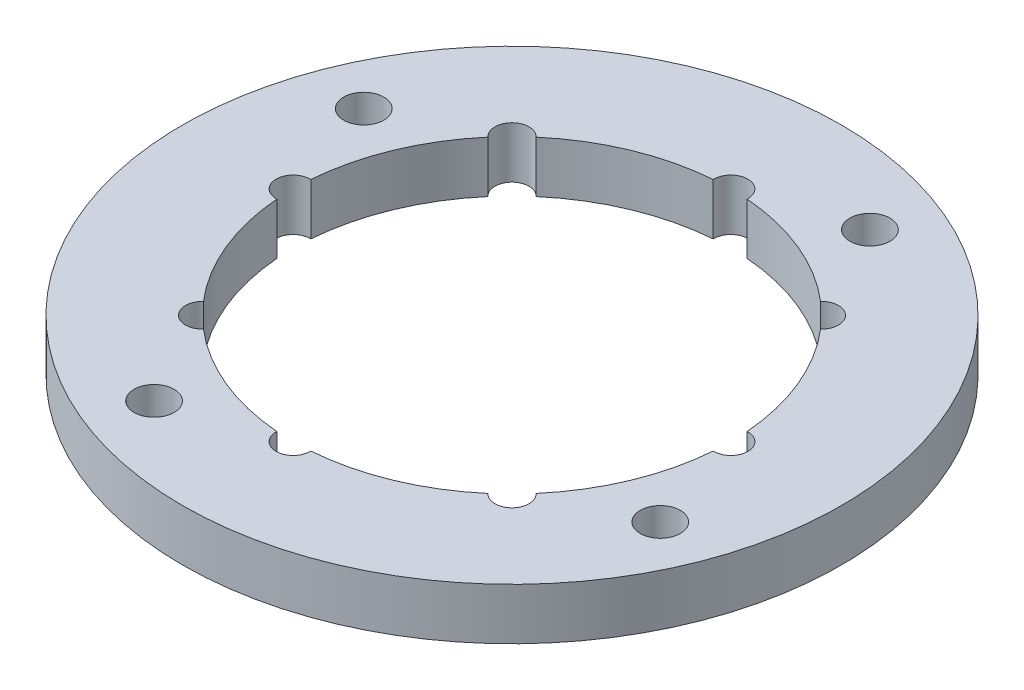
ISO-10303-21;
HEADER;
FILE_DESCRIPTION(('STEP AP214'),'2;1');
FILE_NAME('part.step','',(''),(''),'','','');
FILE_SCHEMA(('AUTOMOTIVE_DESIGN { 1 0 10303 214 1 1 1 1 }'));
ENDSEC;
DATA;
#1=APPLICATION_CONTEXT('core data for automotive mechanical design processes');
#2=APPLICATION_PROTOCOL_DEFINITION('international standard','automotive_design',2000,#1);
#3=PRODUCT_CONTEXT('',#1,'mechanical');
#4=PRODUCT('Part','Part','',(#3));
#5=PRODUCT_RELATED_PRODUCT_CATEGORY('part','',(#4));
#6=PRODUCT_DEFINITION_FORMATION('','',#4);
#7=PRODUCT_DEFINITION_CONTEXT('part definition',#1,'design');
#8=PRODUCT_DEFINITION('design','',#6,#7);
#9=PRODUCT_DEFINITION_SHAPE('','',#8);
#10=(LENGTH_UNIT() NAMED_UNIT(*) SI_UNIT(.MILLI.,.METRE.));
#11=(NAMED_UNIT(*) PLANE_ANGLE_UNIT() SI_UNIT($,.RADIAN.));
#12=(NAMED_UNIT(*) SI_UNIT($,.STERADIAN.) SOLID_ANGLE_UNIT());
#13=UNCERTAINTY_MEASURE_WITH_UNIT(LENGTH_MEASURE(1.E-05),#10,'distance_accuracy_value','');
#14=(GEOMETRIC_REPRESENTATION_CONTEXT(3) GLOBAL_UNCERTAINTY_ASSIGNED_CONTEXT((#13)) GLOBAL_UNIT_ASSIGNED_CONTEXT((#10,
#11,#12)) REPRESENTATION_CONTEXT('',''));
#15=CARTESIAN_POINT('',(0.,0.,0.));
#16=DIRECTION('',(0.,0.,1.));
#17=DIRECTION('',(1.,0.,0.));
#18=AXIS2_PLACEMENT_3D('',#15,#16,#17);
#19=CARTESIAN_POINT('',(-19.0830442572718,6.35,-19.0830442572718));
#20=DIRECTION('',(0.,-1.,0.));
#21=DIRECTION('',(0.,0.,-1.));
#22=AXIS2_PLACEMENT_3D('',#19,#20,#21);
#23=CYLINDRICAL_SURFACE('',#22,2.09550000000003);
#24=CARTESIAN_POINT('',(-19.0830442572718,0.,-19.0830442572718));
#25=DIRECTION('',(0.,1.,0.));
#26=DIRECTION('',(0.,0.,1.));
#27=AXIS2_PLACEMENT_3D('',#24,#25,#26);
#28=CIRCLE('',#27,2.09550000000003);
#29=CARTESIAN_POINT('',(-20.5061429417451,0.,-17.5448926443771));
#30=VERTEX_POINT('',#29);
#31=CARTESIAN_POINT('',(-17.5448926443771,0.,-20.5061429417451));
#32=VERTEX_POINT('',#31);
#33=EDGE_CURVE('E203',#30,#32,#28,.F.);
#34=ORIENTED_EDGE('',*,*,#33,.T.);
#35=DIRECTION('',(0.,-1.,0.));
#36=VECTOR('',#35,1.);
#37=CARTESIAN_POINT('',(-17.5448926443771,6.35,-20.5061429417451));
#38=LINE('',#37,#36);
#39=CARTESIAN_POINT('',(-17.5448926443771,6.35,-20.5061429417451));
#40=VERTEX_POINT('',#39);
#41=EDGE_CURVE('E11',#40,#32,#38,.T.);
#42=ORIENTED_EDGE('',*,*,#41,.F.);
#43=CARTESIAN_POINT('',(-19.0830442572718,6.35,-19.0830442572718));
#44=DIRECTION('',(0.,1.,0.));
#45=DIRECTION('',(0.,0.,1.));
#46=AXIS2_PLACEMENT_3D('',#43,#44,#45);
#47=CIRCLE('',#46,2.09550000000003);
#48=CARTESIAN_POINT('',(-20.5061429417451,6.35,-17.5448926443771));
#49=VERTEX_POINT('',#48);
#50=EDGE_CURVE('E318',#49,#40,#47,.F.);
#51=ORIENTED_EDGE('',*,*,#50,.F.);
#52=DIRECTION('',(0.,-1.,0.));
#53=VECTOR('',#52,1.);
#54=CARTESIAN_POINT('',(-20.5061429417451,6.35,-17.5448926443771));
#55=LINE('',#54,#53);
#56=EDGE_CURVE('E185',#49,#30,#55,.T.);
#57=ORIENTED_EDGE('',*,*,#56,.T.);
#58=EDGE_LOOP('',(#34,#42,#51,#57));
#59=FACE_BOUND('',#58,.T.);
#60=ADVANCED_FACE('F41',(#59),#23,.F.);
#61=CARTESIAN_POINT('',(0.,6.35,0.));
#62=DIRECTION('',(0.,-1.,0.));
#63=DIRECTION('',(0.,0.,-1.));
#64=AXIS2_PLACEMENT_3D('',#61,#62,#63);
#65=CYLINDRICAL_SURFACE('',#64,26.9875);
#66=CARTESIAN_POINT('',(0.,0.,0.));
#67=DIRECTION('',(0.,1.,0.));
#68=DIRECTION('',(0.,0.,1.));
#69=AXIS2_PLACEMENT_3D('',#66,#67,#68);
#70=CIRCLE('',#69,26.9875);
#71=CARTESIAN_POINT('',(-2.09392016605936,0.,-26.9061452941177));
#72=VERTEX_POINT('',#71);
#73=EDGE_CURVE('E204',#32,#72,#70,.F.);
#74=ORIENTED_EDGE('',*,*,#73,.T.);
#75=DIRECTION('',(0.,-1.,0.));
#76=VECTOR('',#75,1.);
#77=CARTESIAN_POINT('',(-2.09392016605936,6.35,-26.9061452941177));
#78=LINE('',#77,#76);
#79=CARTESIAN_POINT('',(-2.09392016605936,6.35,-26.9061452941177));
#80=VERTEX_POINT('',#79);
#81=EDGE_CURVE('E49',#80,#72,#78,.T.);
#82=ORIENTED_EDGE('',*,*,#81,.F.);
#83=CARTESIAN_POINT('',(0.,6.35,0.));
#84=DIRECTION('',(0.,1.,0.));
#85=DIRECTION('',(0.,0.,1.));
#86=AXIS2_PLACEMENT_3D('',#83,#84,#85);
#87=CIRCLE('',#86,26.9875);
#88=EDGE_CURVE('E122',#40,#80,#87,.F.);
#89=ORIENTED_EDGE('',*,*,#88,.F.);
#90=ORIENTED_EDGE('',*,*,#41,.T.);
#91=EDGE_LOOP('',(#74,#82,#89,#90));
#92=FACE_BOUND('',#91,.T.);
#93=ADVANCED_FACE('F334',(#92),#65,.F.);
#94=CARTESIAN_POINT('',(1.11022302462516E-13,6.35,-26.9874999999999));
#95=DIRECTION('',(0.,-1.,0.));
#96=DIRECTION('',(0.,0.,-1.));
#97=AXIS2_PLACEMENT_3D('',#94,#95,#96);
#98=CYLINDRICAL_SURFACE('',#97,2.09549999999993);
#99=CARTESIAN_POINT('',(1.11022302462516E-13,0.,-26.9874999999999));
#100=DIRECTION('',(0.,1.,0.));
#101=DIRECTION('',(0.,0.,1.));
#102=AXIS2_PLACEMENT_3D('',#99,#100,#101);
#103=CIRCLE('',#102,2.09549999999993);
#104=CARTESIAN_POINT('',(2.09392016605958,0.,-26.9061452941177));
#105=VERTEX_POINT('',#104);
#106=EDGE_CURVE('E206',#72,#105,#103,.F.);
#107=ORIENTED_EDGE('',*,*,#106,.T.);
#108=DIRECTION('',(0.,-1.,0.));
#109=VECTOR('',#108,1.);
#110=CARTESIAN_POINT('',(2.09392016605958,6.35,-26.9061452941177));
#111=LINE('',#110,#109);
#112=CARTESIAN_POINT('',(2.09392016605958,6.35,-26.9061452941177));
#113=VERTEX_POINT('',#112);
#114=EDGE_CURVE('E265',#113,#105,#111,.T.);
#115=ORIENTED_EDGE('',*,*,#114,.F.);
#116=CARTESIAN_POINT('',(1.11022302462516E-13,6.35,-26.9874999999999));
#117=DIRECTION('',(0.,1.,0.));
#118=DIRECTION('',(0.,0.,1.));
#119=AXIS2_PLACEMENT_3D('',#116,#117,#118);
#120=CIRCLE('',#119,2.09549999999993);
#121=EDGE_CURVE('E269',#80,#113,#120,.F.);
#122=ORIENTED_EDGE('',*,*,#121,.F.);
#123=ORIENTED_EDGE('',*,*,#81,.T.);
#124=EDGE_LOOP('',(#107,#115,#122,#123));
#125=FACE_BOUND('',#124,.T.);
#126=ADVANCED_FACE('F268',(#125),#98,.F.);
#127=CARTESIAN_POINT('',(0.,6.35,0.));
#128=DIRECTION('',(0.,-1.,0.));
#129=DIRECTION('',(0.,0.,-1.));
#130=AXIS2_PLACEMENT_3D('',#127,#128,#129);
#131=CYLINDRICAL_SURFACE('',#130,26.9875);
#132=CARTESIAN_POINT('',(0.,0.,0.));
#133=DIRECTION('',(0.,1.,0.));
#134=DIRECTION('',(0.,0.,1.));
#135=AXIS2_PLACEMENT_3D('',#132,#133,#134);
#136=CIRCLE('',#135,26.9875);
#137=CARTESIAN_POINT('',(17.5448926443797,0.,-20.5061429417429));
#138=VERTEX_POINT('',#137);
#139=EDGE_CURVE('E208',#105,#138,#136,.F.);
#140=ORIENTED_EDGE('',*,*,#139,.T.);
#141=DIRECTION('',(0.,-1.,0.));
#142=VECTOR('',#141,1.);
#143=CARTESIAN_POINT('',(17.5448926443797,6.35,-20.5061429417429));
#144=LINE('',#143,#142);
#145=CARTESIAN_POINT('',(17.5448926443797,6.35,-20.5061429417429));
#146=VERTEX_POINT('',#145);
#147=EDGE_CURVE('E259',#146,#138,#144,.T.);
#148=ORIENTED_EDGE('',*,*,#147,.F.);
#149=CARTESIAN_POINT('',(0.,6.35,0.));
#150=DIRECTION('',(0.,1.,0.));
#151=DIRECTION('',(0.,0.,1.));
#152=AXIS2_PLACEMENT_3D('',#149,#150,#151);
#153=CIRCLE('',#152,26.9875);
#154=EDGE_CURVE('E290',#113,#146,#153,.F.);
#155=ORIENTED_EDGE('',*,*,#154,.F.);
#156=ORIENTED_EDGE('',*,*,#114,.T.);
#157=EDGE_LOOP('',(#140,#148,#155,#156));
#158=FACE_BOUND('',#157,.T.);
#159=ADVANCED_FACE('F276',(#158),#131,.F.);
#160=CARTESIAN_POINT('',(19.0830442572715,6.35,-19.0830442572726));
#161=DIRECTION('',(0.,-1.,0.));
#162=DIRECTION('',(0.,0.,-1.));
#163=AXIS2_PLACEMENT_3D('',#160,#161,#162);
#164=CYLINDRICAL_SURFACE('',#163,2.09549999999588);
#165=CARTESIAN_POINT('',(19.0830442572715,0.,-19.0830442572726));
#166=DIRECTION('',(0.,1.,0.));
#167=DIRECTION('',(0.,0.,1.));
#168=AXIS2_PLACEMENT_3D('',#165,#166,#167);
#169=CIRCLE('',#168,2.09549999999588);
#170=CARTESIAN_POINT('',(20.5061429417419,0.,-17.5448926443808));
#171=VERTEX_POINT('',#170);
#172=EDGE_CURVE('E209',#138,#171,#169,.F.);
#173=ORIENTED_EDGE('',*,*,#172,.T.);
#174=DIRECTION('',(0.,-1.,0.));
#175=VECTOR('',#174,1.);
#176=CARTESIAN_POINT('',(20.5061429417419,6.35,-17.5448926443808));
#177=LINE('',#176,#175);
#178=CARTESIAN_POINT('',(20.5061429417419,6.35,-17.5448926443808));
#179=VERTEX_POINT('',#178);
#180=EDGE_CURVE('E258',#179,#171,#177,.T.);
#181=ORIENTED_EDGE('',*,*,#180,.F.);
#182=CARTESIAN_POINT('',(19.0830442572715,6.35,-19.0830442572726));
#183=DIRECTION('',(0.,1.,0.));
#184=DIRECTION('',(0.,0.,1.));
#185=AXIS2_PLACEMENT_3D('',#182,#183,#184);
#186=CIRCLE('',#185,2.09549999999588);
#187=EDGE_CURVE('E284',#146,#179,#186,.F.);
#188=ORIENTED_EDGE('',*,*,#187,.F.);
#189=ORIENTED_EDGE('',*,*,#147,.T.);
#190=EDGE_LOOP('',(#173,#181,#188,#189));
#191=FACE_BOUND('',#190,.T.);
#192=ADVANCED_FACE('F282',(#191),#164,.F.);
#193=CARTESIAN_POINT('',(0.,6.35,0.));
#194=DIRECTION('',(0.,-1.,0.));
#195=DIRECTION('',(0.,0.,-1.));
#196=AXIS2_PLACEMENT_3D('',#193,#194,#195);
#197=CYLINDRICAL_SURFACE('',#196,26.9875);
#198=CARTESIAN_POINT('',(0.,0.,0.));
#199=DIRECTION('',(0.,1.,0.));
#200=DIRECTION('',(0.,0.,1.));
#201=AXIS2_PLACEMENT_3D('',#198,#199,#200);
#202=CIRCLE('',#201,26.9875);
#203=CARTESIAN_POINT('',(26.9061452941176,0.,-2.09392016605953));
#204=VERTEX_POINT('',#203);
#205=EDGE_CURVE('E215',#171,#204,#202,.F.);
#206=ORIENTED_EDGE('',*,*,#205,.T.);
#207=DIRECTION('',(0.,-1.,0.));
#208=VECTOR('',#207,1.);
#209=CARTESIAN_POINT('',(26.9061452941176,6.35,-2.09392016605953));
#210=LINE('',#209,#208);
#211=CARTESIAN_POINT('',(26.9061452941176,6.35,-2.09392016605953));
#212=VERTEX_POINT('',#211);
#213=EDGE_CURVE('E251',#212,#204,#210,.T.);
#214=ORIENTED_EDGE('',*,*,#213,.F.);
#215=CARTESIAN_POINT('',(0.,6.35,0.));
#216=DIRECTION('',(0.,1.,0.));
#217=DIRECTION('',(0.,0.,1.));
#218=AXIS2_PLACEMENT_3D('',#215,#216,#217);
#219=CIRCLE('',#218,26.9875);
#220=EDGE_CURVE('E286',#179,#212,#219,.F.);
#221=ORIENTED_EDGE('',*,*,#220,.F.);
#222=ORIENTED_EDGE('',*,*,#180,.T.);
#223=EDGE_LOOP('',(#206,#214,#221,#222));
#224=FACE_BOUND('',#223,.T.);
#225=ADVANCED_FACE('F495',(#224),#197,.F.);
#226=CARTESIAN_POINT('',(26.9875000000012,6.35,-4.30211422042248E-13));
#227=DIRECTION('',(0.,-1.,0.));
#228=DIRECTION('',(0.,0.,-1.));
#229=AXIS2_PLACEMENT_3D('',#226,#227,#228);
#230=CYLINDRICAL_SURFACE('',#229,2.09549999999961);
#231=CARTESIAN_POINT('',(26.9875000000012,0.,-4.30211422042248E-13));
#232=DIRECTION('',(0.,1.,0.));
#233=DIRECTION('',(0.,0.,1.));
#234=AXIS2_PLACEMENT_3D('',#231,#232,#233);
#235=CIRCLE('',#234,2.09549999999961);
#236=CARTESIAN_POINT('',(26.9061452941177,0.,2.09392016605867));
#237=VERTEX_POINT('',#236);
#238=EDGE_CURVE('E212',#204,#237,#235,.F.);
#239=ORIENTED_EDGE('',*,*,#238,.T.);
#240=DIRECTION('',(0.,-1.,0.));
#241=VECTOR('',#240,1.);
#242=CARTESIAN_POINT('',(26.9061452941177,6.35,2.09392016605867));
#243=LINE('',#242,#241);
#244=CARTESIAN_POINT('',(26.9061452941177,6.35,2.09392016605867));
#245=VERTEX_POINT('',#244);
#246=EDGE_CURVE('E247',#245,#237,#243,.T.);
#247=ORIENTED_EDGE('',*,*,#246,.F.);
#248=CARTESIAN_POINT('',(26.9875000000012,6.35,-4.30211422042248E-13));
#249=DIRECTION('',(0.,1.,0.));
#250=DIRECTION('',(0.,0.,1.));
#251=AXIS2_PLACEMENT_3D('',#248,#249,#250);
#252=CIRCLE('',#251,2.09549999999961);
#253=EDGE_CURVE('E287',#212,#245,#252,.F.);
#254=ORIENTED_EDGE('',*,*,#253,.F.);
#255=ORIENTED_EDGE('',*,*,#213,.T.);
#256=EDGE_LOOP('',(#239,#247,#254,#255));
#257=FACE_BOUND('',#256,.T.);
#258=ADVANCED_FACE('F483',(#257),#230,.F.);
#259=CARTESIAN_POINT('',(0.,6.35,0.));
#260=DIRECTION('',(0.,-1.,0.));
#261=DIRECTION('',(0.,0.,-1.));
#262=AXIS2_PLACEMENT_3D('',#259,#260,#261);
#263=CYLINDRICAL_SURFACE('',#262,26.9875);
#264=CARTESIAN_POINT('',(0.,0.,0.));
#265=DIRECTION('',(0.,1.,0.));
#266=DIRECTION('',(0.,0.,1.));
#267=AXIS2_PLACEMENT_3D('',#264,#265,#266);
#268=CIRCLE('',#267,26.9875);
#269=CARTESIAN_POINT('',(20.5061429417444,0.,17.5448926443779));
#270=VERTEX_POINT('',#269);
#271=EDGE_CURVE('E216',#237,#270,#268,.F.);
#272=ORIENTED_EDGE('',*,*,#271,.T.);
#273=DIRECTION('',(0.,-1.,0.));
#274=VECTOR('',#273,1.);
#275=CARTESIAN_POINT('',(20.5061429417444,6.35,17.5448926443779));
#276=LINE('',#275,#274);
#277=CARTESIAN_POINT('',(20.5061429417444,6.35,17.5448926443779));
#278=VERTEX_POINT('',#277);
#279=EDGE_CURVE('E246',#278,#270,#276,.T.);
#280=ORIENTED_EDGE('',*,*,#279,.F.);
#281=CARTESIAN_POINT('',(0.,6.35,0.));
#282=DIRECTION('',(0.,1.,0.));
#283=DIRECTION('',(0.,0.,1.));
#284=AXIS2_PLACEMENT_3D('',#281,#282,#283);
#285=CIRCLE('',#284,26.9875);
#286=EDGE_CURVE('E296',#245,#278,#285,.F.);
#287=ORIENTED_EDGE('',*,*,#286,.F.);
#288=ORIENTED_EDGE('',*,*,#246,.T.);
#289=EDGE_LOOP('',(#272,#280,#287,#288));
#290=FACE_BOUND('',#289,.T.);
#291=ADVANCED_FACE('F475',(#290),#263,.F.);
#292=CARTESIAN_POINT('',(19.0830442572704,6.35,19.0830442572693));
#293=DIRECTION('',(0.,-1.,0.));
#294=DIRECTION('',(0.,0.,-1.));
#295=AXIS2_PLACEMENT_3D('',#292,#293,#294);
#296=CYLINDRICAL_SURFACE('',#295,2.09549999999814);
#297=CARTESIAN_POINT('',(19.0830442572704,0.,19.0830442572693));
#298=DIRECTION('',(0.,1.,0.));
#299=DIRECTION('',(0.,0.,1.));
#300=AXIS2_PLACEMENT_3D('',#297,#298,#299);
#301=CIRCLE('',#300,2.09549999999814);
#302=CARTESIAN_POINT('',(17.5448926443791,0.,20.5061429417434));
#303=VERTEX_POINT('',#302);
#304=EDGE_CURVE('E217',#270,#303,#301,.F.);
#305=ORIENTED_EDGE('',*,*,#304,.T.);
#306=DIRECTION('',(0.,-1.,0.));
#307=VECTOR('',#306,1.);
#308=CARTESIAN_POINT('',(17.5448926443791,6.35,20.5061429417434));
#309=LINE('',#308,#307);
#310=CARTESIAN_POINT('',(17.5448926443791,6.35,20.5061429417434));
#311=VERTEX_POINT('',#310);
#312=EDGE_CURVE('E243',#311,#303,#309,.T.);
#313=ORIENTED_EDGE('',*,*,#312,.F.);
#314=CARTESIAN_POINT('',(19.0830442572704,6.35,19.0830442572693));
#315=DIRECTION('',(0.,1.,0.));
#316=DIRECTION('',(0.,0.,1.));
#317=AXIS2_PLACEMENT_3D('',#314,#315,#316);
#318=CIRCLE('',#317,2.09549999999814);
#319=EDGE_CURVE('E297',#278,#311,#318,.F.);
#320=ORIENTED_EDGE('',*,*,#319,.F.);
#321=ORIENTED_EDGE('',*,*,#279,.T.);
#322=EDGE_LOOP('',(#305,#313,#320,#321));
#323=FACE_BOUND('',#322,.T.);
#324=ADVANCED_FACE('F464',(#323),#296,.F.);
#325=CARTESIAN_POINT('',(0.,6.35,0.));
#326=DIRECTION('',(0.,-1.,0.));
#327=DIRECTION('',(0.,0.,-1.));
#328=AXIS2_PLACEMENT_3D('',#325,#326,#327);
#329=CYLINDRICAL_SURFACE('',#328,26.9875);
#330=CARTESIAN_POINT('',(0.,0.,0.));
#331=DIRECTION('',(0.,1.,0.));
#332=DIRECTION('',(0.,0.,1.));
#333=AXIS2_PLACEMENT_3D('',#330,#331,#332);
#334=CIRCLE('',#333,26.9875);
#335=CARTESIAN_POINT('',(2.09392016605725,0.,26.9061452941178));
#336=VERTEX_POINT('',#335);
#337=EDGE_CURVE('E219',#303,#336,#334,.F.);
#338=ORIENTED_EDGE('',*,*,#337,.T.);
#339=DIRECTION('',(0.,-1.,0.));
#340=VECTOR('',#339,1.);
#341=CARTESIAN_POINT('',(2.09392016605725,6.35,26.9061452941178));
#342=LINE('',#341,#340);
#343=CARTESIAN_POINT('',(2.09392016605725,6.35,26.9061452941178));
#344=VERTEX_POINT('',#343);
#345=EDGE_CURVE('E241',#344,#336,#342,.T.);
#346=ORIENTED_EDGE('',*,*,#345,.F.);
#347=CARTESIAN_POINT('',(0.,6.35,0.));
#348=DIRECTION('',(0.,1.,0.));
#349=DIRECTION('',(0.,0.,1.));
#350=AXIS2_PLACEMENT_3D('',#347,#348,#349);
#351=CIRCLE('',#350,26.9875);
#352=EDGE_CURVE('E299',#311,#344,#351,.F.);
#353=ORIENTED_EDGE('',*,*,#352,.F.);
#354=ORIENTED_EDGE('',*,*,#312,.T.);
#355=EDGE_LOOP('',(#338,#346,#353,#354));
#356=FACE_BOUND('',#355,.T.);
#357=ADVANCED_FACE('F457',(#356),#329,.F.);
#358=CARTESIAN_POINT('',(0.,6.35,26.9875000000033));
#359=DIRECTION('',(0.,-1.,0.));
#360=DIRECTION('',(0.,0.,-1.));
#361=AXIS2_PLACEMENT_3D('',#358,#359,#360);
#362=CYLINDRICAL_SURFACE('',#361,2.09549999999783);
#363=CARTESIAN_POINT('',(0.,0.,26.9875000000033));
#364=DIRECTION('',(0.,1.,0.));
#365=DIRECTION('',(0.,0.,1.));
#366=AXIS2_PLACEMENT_3D('',#363,#364,#365);
#367=CIRCLE('',#366,2.09549999999783);
#368=CARTESIAN_POINT('',(-2.09392016605724,0.,26.9061452941178));
#369=VERTEX_POINT('',#368);
#370=EDGE_CURVE('E225',#336,#369,#367,.F.);
#371=ORIENTED_EDGE('',*,*,#370,.T.);
#372=DIRECTION('',(0.,-1.,0.));
#373=VECTOR('',#372,1.);
#374=CARTESIAN_POINT('',(-2.09392016605724,6.35,26.9061452941178));
#375=LINE('',#374,#373);
#376=CARTESIAN_POINT('',(-2.09392016605724,6.35,26.9061452941178));
#377=VERTEX_POINT('',#376);
#378=EDGE_CURVE('E236',#377,#369,#375,.T.);
#379=ORIENTED_EDGE('',*,*,#378,.F.);
#380=CARTESIAN_POINT('',(0.,6.35,26.9875000000033));
#381=DIRECTION('',(0.,1.,0.));
#382=DIRECTION('',(0.,0.,1.));
#383=AXIS2_PLACEMENT_3D('',#380,#381,#382);
#384=CIRCLE('',#383,2.09549999999783);
#385=EDGE_CURVE('E301',#344,#377,#384,.F.);
#386=ORIENTED_EDGE('',*,*,#385,.F.);
#387=ORIENTED_EDGE('',*,*,#345,.T.);
#388=EDGE_LOOP('',(#371,#379,#386,#387));
#389=FACE_BOUND('',#388,.T.);
#390=ADVANCED_FACE('F447',(#389),#362,.F.);
#391=CARTESIAN_POINT('',(0.,6.35,0.));
#392=DIRECTION('',(0.,-1.,0.));
#393=DIRECTION('',(0.,0.,-1.));
#394=AXIS2_PLACEMENT_3D('',#391,#392,#393);
#395=CYLINDRICAL_SURFACE('',#394,26.9875);
#396=CARTESIAN_POINT('',(0.,0.,0.));
#397=DIRECTION('',(0.,1.,0.));
#398=DIRECTION('',(0.,0.,1.));
#399=AXIS2_PLACEMENT_3D('',#396,#397,#398);
#400=CIRCLE('',#399,26.9875);
#401=CARTESIAN_POINT('',(-17.5448926443771,0.,20.506142941745));
#402=VERTEX_POINT('',#401);
#403=EDGE_CURVE('E221',#369,#402,#400,.F.);
#404=ORIENTED_EDGE('',*,*,#403,.T.);
#405=DIRECTION('',(0.,-1.,0.));
#406=VECTOR('',#405,1.);
#407=CARTESIAN_POINT('',(-17.5448926443771,6.35,20.506142941745));
#408=LINE('',#407,#406);
#409=CARTESIAN_POINT('',(-17.5448926443771,6.35,20.506142941745));
#410=VERTEX_POINT('',#409);
#411=EDGE_CURVE('E232',#410,#402,#408,.T.);
#412=ORIENTED_EDGE('',*,*,#411,.F.);
#413=CARTESIAN_POINT('',(0.,6.35,0.));
#414=DIRECTION('',(0.,1.,0.));
#415=DIRECTION('',(0.,0.,1.));
#416=AXIS2_PLACEMENT_3D('',#413,#414,#415);
#417=CIRCLE('',#416,26.9875);
#418=EDGE_CURVE('E303',#377,#410,#417,.F.);
#419=ORIENTED_EDGE('',*,*,#418,.F.);
#420=ORIENTED_EDGE('',*,*,#378,.T.);
#421=EDGE_LOOP('',(#404,#412,#419,#420));
#422=FACE_BOUND('',#421,.T.);
#423=ADVANCED_FACE('F309',(#422),#395,.F.);
#424=CARTESIAN_POINT('',(-19.0830442572707,6.35,19.0830442572718));
#425=DIRECTION('',(0.,-1.,0.));
#426=DIRECTION('',(0.,0.,-1.));
#427=AXIS2_PLACEMENT_3D('',#424,#425,#426);
#428=CYLINDRICAL_SURFACE('',#427,2.09549999999915);
#429=CARTESIAN_POINT('',(-19.0830442572707,0.,19.0830442572718));
#430=DIRECTION('',(0.,1.,0.));
#431=DIRECTION('',(0.,0.,1.));
#432=AXIS2_PLACEMENT_3D('',#429,#430,#431);
#433=CIRCLE('',#432,2.09549999999915);
#434=CARTESIAN_POINT('',(-20.506142941744,0.,17.5448926443783));
#435=VERTEX_POINT('',#434);
#436=EDGE_CURVE('E226',#402,#435,#433,.F.);
#437=ORIENTED_EDGE('',*,*,#436,.T.);
#438=DIRECTION('',(0.,-1.,0.));
#439=VECTOR('',#438,1.);
#440=CARTESIAN_POINT('',(-20.506142941744,6.35,17.5448926443783));
#441=LINE('',#440,#439);
#442=CARTESIAN_POINT('',(-20.506142941744,6.35,17.5448926443783));
#443=VERTEX_POINT('',#442);
#444=EDGE_CURVE('E176',#443,#435,#441,.T.);
#445=ORIENTED_EDGE('',*,*,#444,.F.);
#446=CARTESIAN_POINT('',(-19.0830442572707,6.35,19.0830442572718));
#447=DIRECTION('',(0.,1.,0.));
#448=DIRECTION('',(0.,0.,1.));
#449=AXIS2_PLACEMENT_3D('',#446,#447,#448);
#450=CIRCLE('',#449,2.09549999999915);
#451=EDGE_CURVE('E169',#410,#443,#450,.F.);
#452=ORIENTED_EDGE('',*,*,#451,.F.);
#453=ORIENTED_EDGE('',*,*,#411,.T.);
#454=EDGE_LOOP('',(#437,#445,#452,#453));
#455=FACE_BOUND('',#454,.T.);
#456=ADVANCED_FACE('F314',(#455),#428,.F.);
#457=CARTESIAN_POINT('',(0.,6.35,0.));
#458=DIRECTION('',(0.,-1.,0.));
#459=DIRECTION('',(0.,0.,-1.));
#460=AXIS2_PLACEMENT_3D('',#457,#458,#459);
#461=CYLINDRICAL_SURFACE('',#460,26.9875);
#462=CARTESIAN_POINT('',(0.,0.,0.));
#463=DIRECTION('',(0.,1.,0.));
#464=DIRECTION('',(0.,0.,1.));
#465=AXIS2_PLACEMENT_3D('',#462,#463,#464);
#466=CIRCLE('',#465,26.9875);
#467=CARTESIAN_POINT('',(-26.9061452941176,0.,2.09392016605954));
#468=VERTEX_POINT('',#467);
#469=EDGE_CURVE('E179',#435,#468,#466,.F.);
#470=ORIENTED_EDGE('',*,*,#469,.T.);
#471=DIRECTION('',(0.,-1.,0.));
#472=VECTOR('',#471,1.);
#473=CARTESIAN_POINT('',(-26.9061452941176,6.35,2.09392016605954));
#474=LINE('',#473,#472);
#475=CARTESIAN_POINT('',(-26.9061452941176,6.35,2.09392016605954));
#476=VERTEX_POINT('',#475);
#477=EDGE_CURVE('E172',#476,#468,#474,.T.);
#478=ORIENTED_EDGE('',*,*,#477,.F.);
#479=CARTESIAN_POINT('',(0.,6.35,0.));
#480=DIRECTION('',(0.,1.,0.));
#481=DIRECTION('',(0.,0.,1.));
#482=AXIS2_PLACEMENT_3D('',#479,#480,#481);
#483=CIRCLE('',#482,26.9875);
#484=EDGE_CURVE('E165',#443,#476,#483,.F.);
#485=ORIENTED_EDGE('',*,*,#484,.F.);
#486=ORIENTED_EDGE('',*,*,#444,.T.);
#487=EDGE_LOOP('',(#470,#478,#485,#486));
#488=FACE_BOUND('',#487,.T.);
#489=ADVANCED_FACE('F173',(#488),#461,.F.);
#490=CARTESIAN_POINT('',(-26.9875000000001,6.35,3.95516952522712E-13));
#491=DIRECTION('',(0.,-1.,0.));
#492=DIRECTION('',(0.,0.,-1.));
#493=AXIS2_PLACEMENT_3D('',#490,#491,#492);
#494=CYLINDRICAL_SURFACE('',#493,2.0954999999996);
#495=CARTESIAN_POINT('',(-26.9875000000001,0.,3.95516952522712E-13));
#496=DIRECTION('',(0.,1.,0.));
#497=DIRECTION('',(0.,0.,1.));
#498=AXIS2_PLACEMENT_3D('',#495,#496,#497);
#499=CIRCLE('',#498,2.0954999999996);
#500=CARTESIAN_POINT('',(-26.9061452941177,0.,-2.09392016605874));
#501=VERTEX_POINT('',#500);
#502=EDGE_CURVE('E112',#468,#501,#499,.F.);
#503=ORIENTED_EDGE('',*,*,#502,.T.);
#504=DIRECTION('',(0.,-1.,0.));
#505=VECTOR('',#504,1.);
#506=CARTESIAN_POINT('',(-26.9061452941177,6.35,-2.09392016605874));
#507=LINE('',#506,#505);
#508=CARTESIAN_POINT('',(-26.9061452941177,6.35,-2.09392016605874));
#509=VERTEX_POINT('',#508);
#510=EDGE_CURVE('E180',#509,#501,#507,.T.);
#511=ORIENTED_EDGE('',*,*,#510,.F.);
#512=CARTESIAN_POINT('',(-26.9875000000001,6.35,3.95516952522712E-13));
#513=DIRECTION('',(0.,1.,0.));
#514=DIRECTION('',(0.,0.,1.));
#515=AXIS2_PLACEMENT_3D('',#512,#513,#514);
#516=CIRCLE('',#515,2.0954999999996);
#517=EDGE_CURVE('E167',#476,#509,#516,.F.);
#518=ORIENTED_EDGE('',*,*,#517,.F.);
#519=ORIENTED_EDGE('',*,*,#477,.T.);
#520=EDGE_LOOP('',(#503,#511,#518,#519));
#521=FACE_BOUND('',#520,.T.);
#522=ADVANCED_FACE('F177',(#521),#494,.F.);
#523=CARTESIAN_POINT('',(0.,6.35,0.));
#524=DIRECTION('',(0.,-1.,0.));
#525=DIRECTION('',(0.,0.,-1.));
#526=AXIS2_PLACEMENT_3D('',#523,#524,#525);
#527=CYLINDRICAL_SURFACE('',#526,40.64);
#528=CARTESIAN_POINT('',(0.,6.35,0.));
#529=DIRECTION('',(0.,1.,0.));
#530=DIRECTION('',(0.,0.,1.));
#531=AXIS2_PLACEMENT_3D('',#528,#529,#530);
#532=CIRCLE('',#531,40.64);
#533=CARTESIAN_POINT('',(0.,6.35,40.64));
#534=VERTEX_POINT('',#533);
#535=EDGE_CURVE('E619',#534,#534,#532,.T.);
#536=ORIENTED_EDGE('',*,*,#535,.F.);
#537=EDGE_LOOP('',(#536));
#538=FACE_BOUND('',#537,.T.);
#539=CARTESIAN_POINT('',(0.,0.,0.));
#540=DIRECTION('',(0.,1.,0.));
#541=DIRECTION('',(0.,0.,1.));
#542=AXIS2_PLACEMENT_3D('',#539,#540,#541);
#543=CIRCLE('',#542,40.64);
#544=CARTESIAN_POINT('',(0.,0.,40.64));
#545=VERTEX_POINT('',#544);
#546=EDGE_CURVE('E196',#545,#545,#543,.T.);
#547=ORIENTED_EDGE('',*,*,#546,.T.);
#548=EDGE_LOOP('',(#547));
#549=FACE_BOUND('',#548,.T.);
#550=ADVANCED_FACE('F344',(#538,#549),#527,.T.);
#551=CARTESIAN_POINT('',(-12.9278117121574,6.35,31.2104983672963));
#552=DIRECTION('',(0.,-1.,0.));
#553=DIRECTION('',(0.,0.,-1.));
#554=AXIS2_PLACEMENT_3D('',#551,#552,#553);
#555=CYLINDRICAL_SURFACE('',#554,2.475);
#556=CARTESIAN_POINT('',(-12.9278117121574,6.35,31.2104983672963));
#557=DIRECTION('',(0.,1.,0.));
#558=DIRECTION('',(0.,0.,1.));
#559=AXIS2_PLACEMENT_3D('',#556,#557,#558);
#560=CIRCLE('',#559,2.475);
#561=CARTESIAN_POINT('',(-12.9278117121574,6.35,33.6854983672963));
#562=VERTEX_POINT('',#561);
#563=EDGE_CURVE('E606',#562,#562,#560,.T.);
#564=ORIENTED_EDGE('',*,*,#563,.T.);
#565=EDGE_LOOP('',(#564));
#566=FACE_BOUND('',#565,.T.);
#567=CARTESIAN_POINT('',(-12.9278117121574,0.,31.2104983672963));
#568=DIRECTION('',(0.,1.,0.));
#569=DIRECTION('',(0.,0.,1.));
#570=AXIS2_PLACEMENT_3D('',#567,#568,#569);
#571=CIRCLE('',#570,2.475);
#572=CARTESIAN_POINT('',(-12.9278117121574,0.,33.6854983672963));
#573=VERTEX_POINT('',#572);
#574=EDGE_CURVE('E192',#573,#573,#571,.T.);
#575=ORIENTED_EDGE('',*,*,#574,.F.);
#576=EDGE_LOOP('',(#575));
#577=FACE_BOUND('',#576,.T.);
#578=ADVANCED_FACE('F343',(#566,#577),#555,.F.);
#579=CARTESIAN_POINT('',(-31.2104983672963,6.35,-12.9278117121575));
#580=DIRECTION('',(0.,-1.,0.));
#581=DIRECTION('',(0.,0.,-1.));
#582=AXIS2_PLACEMENT_3D('',#579,#580,#581);
#583=CYLINDRICAL_SURFACE('',#582,2.475);
#584=CARTESIAN_POINT('',(-31.2104983672963,6.35,-12.9278117121575));
#585=DIRECTION('',(0.,1.,0.));
#586=DIRECTION('',(0.,0.,1.));
#587=AXIS2_PLACEMENT_3D('',#584,#585,#586);
#588=CIRCLE('',#587,2.475);
#589=CARTESIAN_POINT('',(-31.2104983672963,6.35,-10.4528117121575));
#590=VERTEX_POINT('',#589);
#591=EDGE_CURVE('E607',#590,#590,#588,.T.);
#592=ORIENTED_EDGE('',*,*,#591,.T.);
#593=EDGE_LOOP('',(#592));
#594=FACE_BOUND('',#593,.T.);
#595=CARTESIAN_POINT('',(-31.2104983672963,0.,-12.9278117121575));
#596=DIRECTION('',(0.,1.,0.));
#597=DIRECTION('',(0.,0.,1.));
#598=AXIS2_PLACEMENT_3D('',#595,#596,#597);
#599=CIRCLE('',#598,2.475);
#600=CARTESIAN_POINT('',(-31.2104983672963,0.,-10.4528117121575));
#601=VERTEX_POINT('',#600);
#602=EDGE_CURVE('E191',#601,#601,#599,.T.);
#603=ORIENTED_EDGE('',*,*,#602,.F.);
#604=EDGE_LOOP('',(#603));
#605=FACE_BOUND('',#604,.T.);
#606=ADVANCED_FACE('F346',(#594,#605),#583,.F.);
#607=CARTESIAN_POINT('',(31.2104983672962,6.35,12.9278117121577));
#608=DIRECTION('',(0.,-1.,0.));
#609=DIRECTION('',(0.,0.,-1.));
#610=AXIS2_PLACEMENT_3D('',#607,#608,#609);
#611=CYLINDRICAL_SURFACE('',#610,2.475);
#612=CARTESIAN_POINT('',(31.2104983672962,6.35,12.9278117121577));
#613=DIRECTION('',(0.,1.,0.));
#614=DIRECTION('',(0.,0.,1.));
#615=AXIS2_PLACEMENT_3D('',#612,#613,#614);
#616=CIRCLE('',#615,2.475);
#617=CARTESIAN_POINT('',(31.2104983672962,6.35,15.4028117121577));
#618=VERTEX_POINT('',#617);
#619=EDGE_CURVE('E358',#618,#618,#616,.T.);
#620=ORIENTED_EDGE('',*,*,#619,.T.);
#621=EDGE_LOOP('',(#620));
#622=FACE_BOUND('',#621,.T.);
#623=CARTESIAN_POINT('',(31.2104983672962,0.,12.9278117121577));
#624=DIRECTION('',(0.,1.,0.));
#625=DIRECTION('',(0.,0.,1.));
#626=AXIS2_PLACEMENT_3D('',#623,#624,#625);
#627=CIRCLE('',#626,2.475);
#628=CARTESIAN_POINT('',(31.2104983672962,0.,15.4028117121577));
#629=VERTEX_POINT('',#628);
#630=EDGE_CURVE('E188',#629,#629,#627,.T.);
#631=ORIENTED_EDGE('',*,*,#630,.F.);
#632=EDGE_LOOP('',(#631));
#633=FACE_BOUND('',#632,.T.);
#634=ADVANCED_FACE('F327',(#622,#633),#611,.F.);
#635=CARTESIAN_POINT('',(12.9278117121576,6.35,-31.2104983672962));
#636=DIRECTION('',(0.,-1.,0.));
#637=DIRECTION('',(0.,0.,-1.));
#638=AXIS2_PLACEMENT_3D('',#635,#636,#637);
#639=CYLINDRICAL_SURFACE('',#638,2.475);
#640=CARTESIAN_POINT('',(12.9278117121576,6.35,-31.2104983672962));
#641=DIRECTION('',(0.,1.,0.));
#642=DIRECTION('',(0.,0.,1.));
#643=AXIS2_PLACEMENT_3D('',#640,#641,#642);
#644=CIRCLE('',#643,2.475);
#645=CARTESIAN_POINT('',(12.9278117121576,6.35,-28.7354983672962));
#646=VERTEX_POINT('',#645);
#647=EDGE_CURVE('E234',#646,#646,#644,.T.);
#648=ORIENTED_EDGE('',*,*,#647,.T.);
#649=EDGE_LOOP('',(#648));
#650=FACE_BOUND('',#649,.T.);
#651=CARTESIAN_POINT('',(12.9278117121576,0.,-31.2104983672962));
#652=DIRECTION('',(0.,1.,0.));
#653=DIRECTION('',(0.,0.,1.));
#654=AXIS2_PLACEMENT_3D('',#651,#652,#653);
#655=CIRCLE('',#654,2.475);
#656=CARTESIAN_POINT('',(12.9278117121576,0.,-28.7354983672962));
#657=VERTEX_POINT('',#656);
#658=EDGE_CURVE('E186',#657,#657,#655,.T.);
#659=ORIENTED_EDGE('',*,*,#658,.F.);
#660=EDGE_LOOP('',(#659));
#661=FACE_BOUND('',#660,.T.);
#662=ADVANCED_FACE('F43',(#650,#661),#639,.F.);
#663=CARTESIAN_POINT('',(0.,6.35,0.));
#664=DIRECTION('',(0.,-1.,0.));
#665=DIRECTION('',(0.,0.,-1.));
#666=AXIS2_PLACEMENT_3D('',#663,#664,#665);
#667=CYLINDRICAL_SURFACE('',#666,26.9875);
#668=CARTESIAN_POINT('',(0.,0.,0.));
#669=DIRECTION('',(0.,1.,0.));
#670=DIRECTION('',(0.,0.,1.));
#671=AXIS2_PLACEMENT_3D('',#668,#669,#670);
#672=CIRCLE('',#671,26.9875);
#673=EDGE_CURVE('E120',#501,#30,#672,.F.);
#674=ORIENTED_EDGE('',*,*,#673,.T.);
#675=ORIENTED_EDGE('',*,*,#56,.F.);
#676=CARTESIAN_POINT('',(0.,6.35,0.));
#677=DIRECTION('',(0.,1.,0.));
#678=DIRECTION('',(0.,0.,1.));
#679=AXIS2_PLACEMENT_3D('',#676,#677,#678);
#680=CIRCLE('',#679,26.9875);
#681=EDGE_CURVE('E59',#509,#49,#680,.F.);
#682=ORIENTED_EDGE('',*,*,#681,.F.);
#683=ORIENTED_EDGE('',*,*,#510,.T.);
#684=EDGE_LOOP('',(#674,#675,#682,#683));
#685=FACE_BOUND('',#684,.T.);
#686=ADVANCED_FACE('F317',(#685),#667,.F.);
#687=CARTESIAN_POINT('',(0.,6.35,0.));
#688=DIRECTION('',(0.,1.,0.));
#689=DIRECTION('',(0.,0.,1.));
#690=AXIS2_PLACEMENT_3D('',#687,#688,#689);
#691=PLANE('',#690);
#692=ORIENTED_EDGE('',*,*,#647,.F.);
#693=EDGE_LOOP('',(#692));
#694=FACE_BOUND('',#693,.T.);
#695=ORIENTED_EDGE('',*,*,#619,.F.);
#696=EDGE_LOOP('',(#695));
#697=FACE_BOUND('',#696,.T.);
#698=ORIENTED_EDGE('',*,*,#591,.F.);
#699=EDGE_LOOP('',(#698));
#700=FACE_BOUND('',#699,.T.);
#701=ORIENTED_EDGE('',*,*,#563,.F.);
#702=EDGE_LOOP('',(#701));
#703=FACE_BOUND('',#702,.T.);
#704=ORIENTED_EDGE('',*,*,#535,.T.);
#705=EDGE_LOOP('',(#704));
#706=FACE_BOUND('',#705,.T.);
#707=ORIENTED_EDGE('',*,*,#50,.T.);
#708=ORIENTED_EDGE('',*,*,#88,.T.);
#709=ORIENTED_EDGE('',*,*,#121,.T.);
#710=ORIENTED_EDGE('',*,*,#154,.T.);
#711=ORIENTED_EDGE('',*,*,#187,.T.);
#712=ORIENTED_EDGE('',*,*,#220,.T.);
#713=ORIENTED_EDGE('',*,*,#253,.T.);
#714=ORIENTED_EDGE('',*,*,#286,.T.);
#715=ORIENTED_EDGE('',*,*,#319,.T.);
#716=ORIENTED_EDGE('',*,*,#352,.T.);
#717=ORIENTED_EDGE('',*,*,#385,.T.);
#718=ORIENTED_EDGE('',*,*,#418,.T.);
#719=ORIENTED_EDGE('',*,*,#451,.T.);
#720=ORIENTED_EDGE('',*,*,#484,.T.);
#721=ORIENTED_EDGE('',*,*,#517,.T.);
#722=ORIENTED_EDGE('',*,*,#681,.T.);
#723=EDGE_LOOP('',(#707,#708,#709,#710,#711,#712,#713,#714,#715,#716,#717,#718,#719,#720,#721,#722));
#724=FACE_BOUND('',#723,.T.);
#725=ADVANCED_FACE('F163',(#694,#697,#700,#703,#706,#724),#691,.T.);
#726=CARTESIAN_POINT('',(0.,0.,0.));
#727=DIRECTION('',(0.,1.,0.));
#728=DIRECTION('',(0.,0.,1.));
#729=AXIS2_PLACEMENT_3D('',#726,#727,#728);
#730=PLANE('',#729);
#731=ORIENTED_EDGE('',*,*,#658,.T.);
#732=EDGE_LOOP('',(#731));
#733=FACE_BOUND('',#732,.T.);
#734=ORIENTED_EDGE('',*,*,#630,.T.);
#735=EDGE_LOOP('',(#734));
#736=FACE_BOUND('',#735,.T.);
#737=ORIENTED_EDGE('',*,*,#602,.T.);
#738=EDGE_LOOP('',(#737));
#739=FACE_BOUND('',#738,.T.);
#740=ORIENTED_EDGE('',*,*,#574,.T.);
#741=EDGE_LOOP('',(#740));
#742=FACE_BOUND('',#741,.T.);
#743=ORIENTED_EDGE('',*,*,#546,.F.);
#744=EDGE_LOOP('',(#743));
#745=FACE_BOUND('',#744,.T.);
#746=ORIENTED_EDGE('',*,*,#33,.F.);
#747=ORIENTED_EDGE('',*,*,#673,.F.);
#748=ORIENTED_EDGE('',*,*,#502,.F.);
#749=ORIENTED_EDGE('',*,*,#469,.F.);
#750=ORIENTED_EDGE('',*,*,#436,.F.);
#751=ORIENTED_EDGE('',*,*,#403,.F.);
#752=ORIENTED_EDGE('',*,*,#370,.F.);
#753=ORIENTED_EDGE('',*,*,#337,.F.);
#754=ORIENTED_EDGE('',*,*,#304,.F.);
#755=ORIENTED_EDGE('',*,*,#271,.F.);
#756=ORIENTED_EDGE('',*,*,#238,.F.);
#757=ORIENTED_EDGE('',*,*,#205,.F.);
#758=ORIENTED_EDGE('',*,*,#172,.F.);
#759=ORIENTED_EDGE('',*,*,#139,.F.);
#760=ORIENTED_EDGE('',*,*,#106,.F.);
#761=ORIENTED_EDGE('',*,*,#73,.F.);
#762=EDGE_LOOP('',(#746,#747,#748,#749,#750,#751,#752,#753,#754,#755,#756,#757,#758,#759,#760,#761));
#763=FACE_BOUND('',#762,.T.);
#764=ADVANCED_FACE('F273',(#733,#736,#739,#742,#745,#763),#730,.F.);
#765=CLOSED_SHELL('',(#60,#93,#126,#159,#192,#225,#258,#291,#324,#357,#390,#423,#456,#489,#522,
#550,#578,#606,#634,#662,#686,#725,#764));
#766=MANIFOLD_SOLID_BREP('B2',#765);
#767=ADVANCED_BREP_SHAPE_REPRESENTATION('',(#18,#766),#14);
#768=SHAPE_DEFINITION_REPRESENTATION(#9,#767);
ENDSEC;
END-ISO-10303-21;
